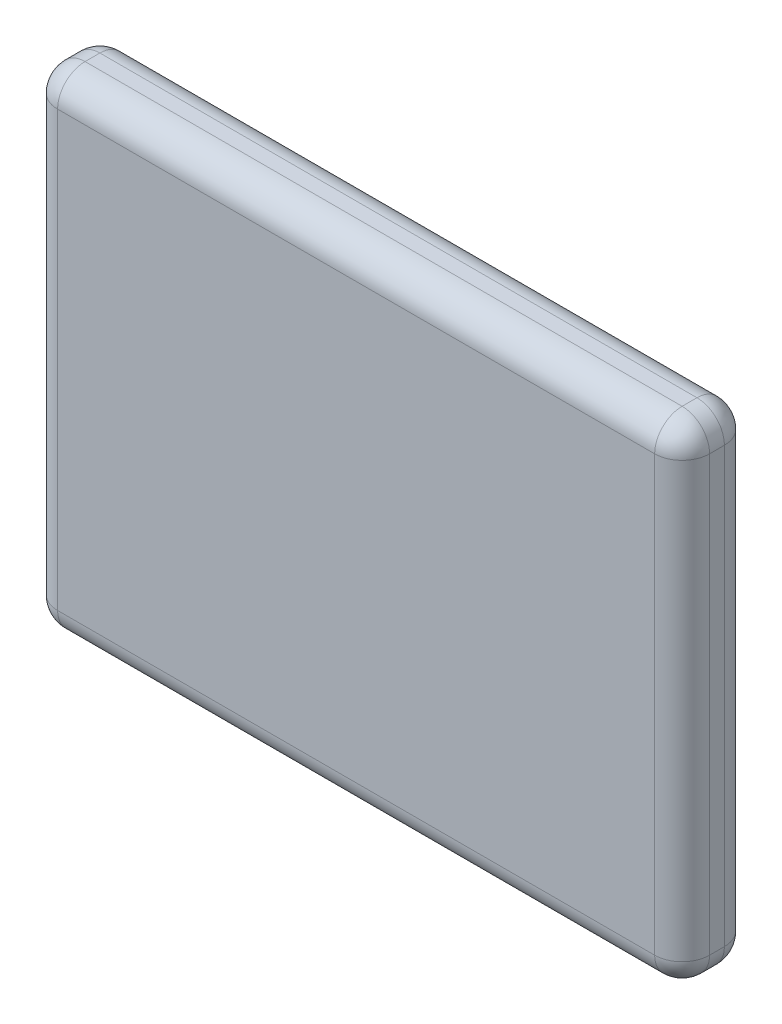
ISO-10303-21;
HEADER;
FILE_DESCRIPTION(('STEP AP214'),'2;1');
FILE_NAME('part.step','',(''),(''),'','','');
FILE_SCHEMA(('AUTOMOTIVE_DESIGN { 1 0 10303 214 1 1 1 1 }'));
ENDSEC;
DATA;
#1=APPLICATION_CONTEXT('core data for automotive mechanical design processes');
#2=APPLICATION_PROTOCOL_DEFINITION('international standard','automotive_design',2000,#1);
#3=PRODUCT_CONTEXT('',#1,'mechanical');
#4=PRODUCT('Part','Part','',(#3));
#5=PRODUCT_RELATED_PRODUCT_CATEGORY('part','',(#4));
#6=PRODUCT_DEFINITION_FORMATION('','',#4);
#7=PRODUCT_DEFINITION_CONTEXT('part definition',#1,'design');
#8=PRODUCT_DEFINITION('design','',#6,#7);
#9=PRODUCT_DEFINITION_SHAPE('','',#8);
#10=(LENGTH_UNIT() NAMED_UNIT(*) SI_UNIT(.MILLI.,.METRE.));
#11=(NAMED_UNIT(*) PLANE_ANGLE_UNIT() SI_UNIT($,.RADIAN.));
#12=(NAMED_UNIT(*) SI_UNIT($,.STERADIAN.) SOLID_ANGLE_UNIT());
#13=UNCERTAINTY_MEASURE_WITH_UNIT(LENGTH_MEASURE(1.E-05),#10,'distance_accuracy_value','');
#14=(GEOMETRIC_REPRESENTATION_CONTEXT(3) GLOBAL_UNCERTAINTY_ASSIGNED_CONTEXT((#13)) GLOBAL_UNIT_ASSIGNED_CONTEXT((#10,
#11,#12)) REPRESENTATION_CONTEXT('',''));
#15=CARTESIAN_POINT('',(0.,0.,0.));
#16=DIRECTION('',(0.,0.,1.));
#17=DIRECTION('',(1.,0.,0.));
#18=AXIS2_PLACEMENT_3D('',#15,#16,#17);
#19=CARTESIAN_POINT('',(-288.838268792711,70.5580865603644,50.8));
#20=DIRECTION('',(1.,0.,0.));
#21=DIRECTION('',(0.,1.,0.));
#22=AXIS2_PLACEMENT_3D('',#19,#20,#21);
#23=PLANE('',#22);
#24=DIRECTION('',(0.,0.,-1.));
#25=VECTOR('',#24,1.);
#26=CARTESIAN_POINT('',(-288.838268792711,50.5580865603644,50.8));
#27=LINE('',#26,#25);
#28=CARTESIAN_POINT('',(-288.838268792711,50.5580865603644,30.8));
#29=VERTEX_POINT('',#28);
#30=CARTESIAN_POINT('',(-288.838268792711,50.5580865603644,20.));
#31=VERTEX_POINT('',#30);
#32=EDGE_CURVE('E145',#29,#31,#27,.T.);
#33=ORIENTED_EDGE('',*,*,#32,.T.);
#34=DIRECTION('',(0.,-1.,0.));
#35=VECTOR('',#34,1.);
#36=CARTESIAN_POINT('',(-288.838268792711,70.5580865603644,20.));
#37=LINE('',#36,#35);
#38=CARTESIAN_POINT('',(-288.838268792711,-265.781913439636,20.));
#39=VERTEX_POINT('',#38);
#40=EDGE_CURVE('E210',#31,#39,#37,.T.);
#41=ORIENTED_EDGE('',*,*,#40,.T.);
#42=DIRECTION('',(0.,0.,-1.));
#43=VECTOR('',#42,1.);
#44=CARTESIAN_POINT('',(-288.838268792711,-265.781913439636,50.8));
#45=LINE('',#44,#43);
#46=CARTESIAN_POINT('',(-288.838268792711,-265.781913439636,30.8));
#47=VERTEX_POINT('',#46);
#48=EDGE_CURVE('E179',#39,#47,#45,.F.);
#49=ORIENTED_EDGE('',*,*,#48,.T.);
#50=DIRECTION('',(0.,-1.,0.));
#51=VECTOR('',#50,1.);
#52=CARTESIAN_POINT('',(-288.838268792711,70.5580865603644,30.8));
#53=LINE('',#52,#51);
#54=EDGE_CURVE('E292',#47,#29,#53,.F.);
#55=ORIENTED_EDGE('',*,*,#54,.T.);
#56=EDGE_LOOP('',(#33,#41,#49,#55));
#57=FACE_BOUND('',#56,.T.);
#58=ADVANCED_FACE('F43',(#57),#23,.F.);
#59=CARTESIAN_POINT('',(-288.838268792711,-285.781913439636,50.8));
#60=DIRECTION('',(0.,1.,0.));
#61=DIRECTION('',(0.,0.,1.));
#62=AXIS2_PLACEMENT_3D('',#59,#60,#61);
#63=PLANE('',#62);
#64=DIRECTION('',(0.,0.,-1.));
#65=VECTOR('',#64,1.);
#66=CARTESIAN_POINT('',(-268.838268792711,-285.781913439636,50.8));
#67=LINE('',#66,#65);
#68=CARTESIAN_POINT('',(-268.838268792711,-285.781913439636,30.8));
#69=VERTEX_POINT('',#68);
#70=CARTESIAN_POINT('',(-268.838268792711,-285.781913439636,20.));
#71=VERTEX_POINT('',#70);
#72=EDGE_CURVE('E249',#69,#71,#67,.T.);
#73=ORIENTED_EDGE('',*,*,#72,.T.);
#74=DIRECTION('',(1.,0.,0.));
#75=VECTOR('',#74,1.);
#76=CARTESIAN_POINT('',(-288.838268792711,-285.781913439636,20.));
#77=LINE('',#76,#75);
#78=CARTESIAN_POINT('',(166.161731207289,-285.781913439636,20.));
#79=VERTEX_POINT('',#78);
#80=EDGE_CURVE('E206',#71,#79,#77,.T.);
#81=ORIENTED_EDGE('',*,*,#80,.T.);
#82=DIRECTION('',(0.,0.,-1.));
#83=VECTOR('',#82,1.);
#84=CARTESIAN_POINT('',(166.161731207289,-285.781913439636,50.8));
#85=LINE('',#84,#83);
#86=CARTESIAN_POINT('',(166.161731207289,-285.781913439636,30.8));
#87=VERTEX_POINT('',#86);
#88=EDGE_CURVE('E256',#79,#87,#85,.F.);
#89=ORIENTED_EDGE('',*,*,#88,.T.);
#90=DIRECTION('',(1.,0.,0.));
#91=VECTOR('',#90,1.);
#92=CARTESIAN_POINT('',(-288.838268792711,-285.781913439636,30.8));
#93=LINE('',#92,#91);
#94=EDGE_CURVE('E255',#87,#69,#93,.F.);
#95=ORIENTED_EDGE('',*,*,#94,.T.);
#96=EDGE_LOOP('',(#73,#81,#89,#95));
#97=FACE_BOUND('',#96,.T.);
#98=ADVANCED_FACE('F252',(#97),#63,.F.);
#99=CARTESIAN_POINT('',(186.161731207289,70.5580865603644,50.8));
#100=DIRECTION('',(-1.,0.,0.));
#101=DIRECTION('',(0.,-1.,0.));
#102=AXIS2_PLACEMENT_3D('',#99,#100,#101);
#103=PLANE('',#102);
#104=DIRECTION('',(0.,0.,-1.));
#105=VECTOR('',#104,1.);
#106=CARTESIAN_POINT('',(186.161731207289,-265.781913439636,50.8));
#107=LINE('',#106,#105);
#108=CARTESIAN_POINT('',(186.161731207289,-265.781913439636,30.8));
#109=VERTEX_POINT('',#108);
#110=CARTESIAN_POINT('',(186.161731207289,-265.781913439636,20.));
#111=VERTEX_POINT('',#110);
#112=EDGE_CURVE('E261',#109,#111,#107,.T.);
#113=ORIENTED_EDGE('',*,*,#112,.T.);
#114=DIRECTION('',(0.,1.,0.));
#115=VECTOR('',#114,1.);
#116=CARTESIAN_POINT('',(186.161731207289,70.5580865603644,20.));
#117=LINE('',#116,#115);
#118=CARTESIAN_POINT('',(186.161731207289,50.5580865603644,20.));
#119=VERTEX_POINT('',#118);
#120=EDGE_CURVE('E193',#111,#119,#117,.T.);
#121=ORIENTED_EDGE('',*,*,#120,.T.);
#122=DIRECTION('',(0.,0.,-1.));
#123=VECTOR('',#122,1.);
#124=CARTESIAN_POINT('',(186.161731207289,50.5580865603644,50.8));
#125=LINE('',#124,#123);
#126=CARTESIAN_POINT('',(186.161731207289,50.5580865603644,30.8));
#127=VERTEX_POINT('',#126);
#128=EDGE_CURVE('E257',#119,#127,#125,.F.);
#129=ORIENTED_EDGE('',*,*,#128,.T.);
#130=DIRECTION('',(0.,1.,0.));
#131=VECTOR('',#130,1.);
#132=CARTESIAN_POINT('',(186.161731207289,-285.781913439636,30.8));
#133=LINE('',#132,#131);
#134=EDGE_CURVE('E140',#127,#109,#133,.F.);
#135=ORIENTED_EDGE('',*,*,#134,.T.);
#136=EDGE_LOOP('',(#113,#121,#129,#135));
#137=FACE_BOUND('',#136,.T.);
#138=ADVANCED_FACE('F323',(#137),#103,.F.);
#139=CARTESIAN_POINT('',(-288.838268792711,70.5580865603644,50.8));
#140=DIRECTION('',(0.,-1.,0.));
#141=DIRECTION('',(0.,0.,-1.));
#142=AXIS2_PLACEMENT_3D('',#139,#140,#141);
#143=PLANE('',#142);
#144=DIRECTION('',(0.,0.,-1.));
#145=VECTOR('',#144,1.);
#146=CARTESIAN_POINT('',(166.161731207289,70.5580865603644,50.8));
#147=LINE('',#146,#145);
#148=CARTESIAN_POINT('',(166.161731207289,70.5580865603644,30.8));
#149=VERTEX_POINT('',#148);
#150=CARTESIAN_POINT('',(166.161731207289,70.5580865603644,20.));
#151=VERTEX_POINT('',#150);
#152=EDGE_CURVE('E283',#149,#151,#147,.T.);
#153=ORIENTED_EDGE('',*,*,#152,.T.);
#154=DIRECTION('',(-1.,0.,0.));
#155=VECTOR('',#154,1.);
#156=CARTESIAN_POINT('',(-288.838268792711,70.5580865603644,20.));
#157=LINE('',#156,#155);
#158=CARTESIAN_POINT('',(-268.838268792711,70.5580865603644,20.));
#159=VERTEX_POINT('',#158);
#160=EDGE_CURVE('E11',#151,#159,#157,.T.);
#161=ORIENTED_EDGE('',*,*,#160,.T.);
#162=DIRECTION('',(0.,0.,-1.));
#163=VECTOR('',#162,1.);
#164=CARTESIAN_POINT('',(-268.838268792711,70.5580865603644,50.8));
#165=LINE('',#164,#163);
#166=CARTESIAN_POINT('',(-268.838268792711,70.5580865603644,30.8));
#167=VERTEX_POINT('',#166);
#168=EDGE_CURVE('E284',#159,#167,#165,.F.);
#169=ORIENTED_EDGE('',*,*,#168,.T.);
#170=DIRECTION('',(-1.,0.,0.));
#171=VECTOR('',#170,1.);
#172=CARTESIAN_POINT('',(186.161731207289,70.5580865603644,30.8));
#173=LINE('',#172,#171);
#174=EDGE_CURVE('E288',#167,#149,#173,.F.);
#175=ORIENTED_EDGE('',*,*,#174,.T.);
#176=EDGE_LOOP('',(#153,#161,#169,#175));
#177=FACE_BOUND('',#176,.T.);
#178=ADVANCED_FACE('F490',(#177),#143,.F.);
#179=CARTESIAN_POINT('',(0.,0.,50.8));
#180=DIRECTION('',(0.,0.,1.));
#181=DIRECTION('',(1.,0.,0.));
#182=AXIS2_PLACEMENT_3D('',#179,#180,#181);
#183=PLANE('',#182);
#184=DIRECTION('',(-1.,0.,0.));
#185=VECTOR('',#184,1.);
#186=CARTESIAN_POINT('',(-288.838268792711,50.5580865603644,50.8));
#187=LINE('',#186,#185);
#188=CARTESIAN_POINT('',(166.161731207289,50.5580865603644,50.8));
#189=VERTEX_POINT('',#188);
#190=CARTESIAN_POINT('',(-268.838268792711,50.5580865603644,50.8));
#191=VERTEX_POINT('',#190);
#192=EDGE_CURVE('E154',#189,#191,#187,.T.);
#193=ORIENTED_EDGE('',*,*,#192,.T.);
#194=DIRECTION('',(0.,-1.,0.));
#195=VECTOR('',#194,1.);
#196=CARTESIAN_POINT('',(-268.838268792711,-285.781913439636,50.8));
#197=LINE('',#196,#195);
#198=CARTESIAN_POINT('',(-268.838268792711,-265.781913439636,50.8));
#199=VERTEX_POINT('',#198);
#200=EDGE_CURVE('E295',#191,#199,#197,.T.);
#201=ORIENTED_EDGE('',*,*,#200,.T.);
#202=DIRECTION('',(1.,0.,0.));
#203=VECTOR('',#202,1.);
#204=CARTESIAN_POINT('',(186.161731207289,-265.781913439636,50.8));
#205=LINE('',#204,#203);
#206=CARTESIAN_POINT('',(166.161731207289,-265.781913439636,50.8));
#207=VERTEX_POINT('',#206);
#208=EDGE_CURVE('E157',#199,#207,#205,.T.);
#209=ORIENTED_EDGE('',*,*,#208,.T.);
#210=DIRECTION('',(0.,1.,0.));
#211=VECTOR('',#210,1.);
#212=CARTESIAN_POINT('',(166.161731207289,70.5580865603644,50.8));
#213=LINE('',#212,#211);
#214=EDGE_CURVE('E137',#207,#189,#213,.T.);
#215=ORIENTED_EDGE('',*,*,#214,.T.);
#216=EDGE_LOOP('',(#193,#201,#209,#215));
#217=FACE_BOUND('',#216,.T.);
#218=ADVANCED_FACE('F152',(#217),#183,.T.);
#219=CARTESIAN_POINT('',(0.,0.,0.));
#220=DIRECTION('',(0.,0.,1.));
#221=DIRECTION('',(1.,0.,0.));
#222=AXIS2_PLACEMENT_3D('',#219,#220,#221);
#223=PLANE('',#222);
#224=DIRECTION('',(-1.,0.,0.));
#225=VECTOR('',#224,1.);
#226=CARTESIAN_POINT('',(0.,50.5580865603644,0.));
#227=LINE('',#226,#225);
#228=CARTESIAN_POINT('',(-268.838268792711,50.5580865603644,0.));
#229=VERTEX_POINT('',#228);
#230=CARTESIAN_POINT('',(166.161731207289,50.5580865603644,0.));
#231=VERTEX_POINT('',#230);
#232=EDGE_CURVE('E195',#229,#231,#227,.F.);
#233=ORIENTED_EDGE('',*,*,#232,.T.);
#234=DIRECTION('',(0.,1.,0.));
#235=VECTOR('',#234,1.);
#236=CARTESIAN_POINT('',(166.161731207289,0.,0.));
#237=LINE('',#236,#235);
#238=CARTESIAN_POINT('',(166.161731207289,-265.781913439636,0.));
#239=VERTEX_POINT('',#238);
#240=EDGE_CURVE('E201',#231,#239,#237,.F.);
#241=ORIENTED_EDGE('',*,*,#240,.T.);
#242=DIRECTION('',(1.,0.,0.));
#243=VECTOR('',#242,1.);
#244=CARTESIAN_POINT('',(0.,-265.781913439636,0.));
#245=LINE('',#244,#243);
#246=CARTESIAN_POINT('',(-268.838268792711,-265.781913439636,0.));
#247=VERTEX_POINT('',#246);
#248=EDGE_CURVE('E199',#239,#247,#245,.F.);
#249=ORIENTED_EDGE('',*,*,#248,.T.);
#250=DIRECTION('',(0.,-1.,0.));
#251=VECTOR('',#250,1.);
#252=CARTESIAN_POINT('',(-268.838268792711,0.,0.));
#253=LINE('',#252,#251);
#254=EDGE_CURVE('E197',#247,#229,#253,.F.);
#255=ORIENTED_EDGE('',*,*,#254,.T.);
#256=EDGE_LOOP('',(#233,#241,#249,#255));
#257=FACE_BOUND('',#256,.T.);
#258=ADVANCED_FACE('F335',(#257),#223,.F.);
#259=CARTESIAN_POINT('',(166.161731207289,0.,30.8));
#260=DIRECTION('',(0.,-1.,0.));
#261=DIRECTION('',(1.,0.,0.));
#262=AXIS2_PLACEMENT_3D('',#259,#260,#261);
#263=CYLINDRICAL_SURFACE('',#262,20.);
#264=ORIENTED_EDGE('',*,*,#134,.F.);
#265=CARTESIAN_POINT('',(166.161731207289,50.5580865603644,30.8));
#266=DIRECTION('',(0.,-1.,0.));
#267=DIRECTION('',(1.,0.,0.));
#268=AXIS2_PLACEMENT_3D('',#265,#266,#267);
#269=CIRCLE('',#268,20.);
#270=EDGE_CURVE('E134',#127,#189,#269,.T.);
#271=ORIENTED_EDGE('',*,*,#270,.T.);
#272=ORIENTED_EDGE('',*,*,#214,.F.);
#273=CARTESIAN_POINT('',(166.161731207289,-265.781913439636,30.8));
#274=DIRECTION('',(0.,-1.,0.));
#275=DIRECTION('',(1.,0.,0.));
#276=AXIS2_PLACEMENT_3D('',#273,#274,#275);
#277=CIRCLE('',#276,20.);
#278=EDGE_CURVE('E146',#207,#109,#277,.F.);
#279=ORIENTED_EDGE('',*,*,#278,.T.);
#280=EDGE_LOOP('',(#264,#271,#272,#279));
#281=FACE_BOUND('',#280,.T.);
#282=ADVANCED_FACE('F136',(#281),#263,.T.);
#283=CARTESIAN_POINT('',(0.,50.5580865603644,30.8));
#284=DIRECTION('',(1.,0.,0.));
#285=DIRECTION('',(0.,0.,-1.));
#286=AXIS2_PLACEMENT_3D('',#283,#284,#285);
#287=CYLINDRICAL_SURFACE('',#286,20.);
#288=ORIENTED_EDGE('',*,*,#174,.F.);
#289=CARTESIAN_POINT('',(-268.838268792711,50.5580865603644,30.8));
#290=DIRECTION('',(1.,0.,0.));
#291=DIRECTION('',(0.,0.,-1.));
#292=AXIS2_PLACEMENT_3D('',#289,#290,#291);
#293=CIRCLE('',#292,20.);
#294=EDGE_CURVE('E165',#167,#191,#293,.T.);
#295=ORIENTED_EDGE('',*,*,#294,.T.);
#296=ORIENTED_EDGE('',*,*,#192,.F.);
#297=CARTESIAN_POINT('',(166.161731207289,50.5580865603644,30.8));
#298=DIRECTION('',(1.,0.,0.));
#299=DIRECTION('',(0.,0.,-1.));
#300=AXIS2_PLACEMENT_3D('',#297,#298,#299);
#301=CIRCLE('',#300,20.);
#302=EDGE_CURVE('E162',#189,#149,#301,.F.);
#303=ORIENTED_EDGE('',*,*,#302,.T.);
#304=EDGE_LOOP('',(#288,#295,#296,#303));
#305=FACE_BOUND('',#304,.T.);
#306=ADVANCED_FACE('F161',(#305),#287,.T.);
#307=CARTESIAN_POINT('',(0.,-265.781913439636,30.8));
#308=DIRECTION('',(-1.,0.,0.));
#309=DIRECTION('',(0.,0.,1.));
#310=AXIS2_PLACEMENT_3D('',#307,#308,#309);
#311=CYLINDRICAL_SURFACE('',#310,20.);
#312=ORIENTED_EDGE('',*,*,#208,.F.);
#313=CARTESIAN_POINT('',(-268.838268792711,-265.781913439636,30.8));
#314=DIRECTION('',(-1.,0.,0.));
#315=DIRECTION('',(0.,0.,1.));
#316=AXIS2_PLACEMENT_3D('',#313,#314,#315);
#317=CIRCLE('',#316,20.);
#318=EDGE_CURVE('E170',#199,#69,#317,.F.);
#319=ORIENTED_EDGE('',*,*,#318,.T.);
#320=ORIENTED_EDGE('',*,*,#94,.F.);
#321=CARTESIAN_POINT('',(166.161731207289,-265.781913439636,30.8));
#322=DIRECTION('',(-1.,0.,0.));
#323=DIRECTION('',(0.,0.,1.));
#324=AXIS2_PLACEMENT_3D('',#321,#322,#323);
#325=CIRCLE('',#324,20.);
#326=EDGE_CURVE('E173',#87,#207,#325,.T.);
#327=ORIENTED_EDGE('',*,*,#326,.T.);
#328=EDGE_LOOP('',(#312,#319,#320,#327));
#329=FACE_BOUND('',#328,.T.);
#330=ADVANCED_FACE('F271',(#329),#311,.T.);
#331=CARTESIAN_POINT('',(-268.838268792711,0.,30.8));
#332=DIRECTION('',(0.,1.,0.));
#333=DIRECTION('',(-1.,0.,0.));
#334=AXIS2_PLACEMENT_3D('',#331,#332,#333);
#335=CYLINDRICAL_SURFACE('',#334,20.);
#336=ORIENTED_EDGE('',*,*,#54,.F.);
#337=CARTESIAN_POINT('',(-268.838268792711,-265.781913439636,30.8));
#338=DIRECTION('',(0.,1.,0.));
#339=DIRECTION('',(-1.,0.,0.));
#340=AXIS2_PLACEMENT_3D('',#337,#338,#339);
#341=CIRCLE('',#340,20.);
#342=EDGE_CURVE('E267',#47,#199,#341,.T.);
#343=ORIENTED_EDGE('',*,*,#342,.T.);
#344=ORIENTED_EDGE('',*,*,#200,.F.);
#345=CARTESIAN_POINT('',(-268.838268792711,50.5580865603644,30.8));
#346=DIRECTION('',(0.,1.,0.));
#347=DIRECTION('',(-1.,0.,0.));
#348=AXIS2_PLACEMENT_3D('',#345,#346,#347);
#349=CIRCLE('',#348,20.);
#350=EDGE_CURVE('E259',#191,#29,#349,.F.);
#351=ORIENTED_EDGE('',*,*,#350,.T.);
#352=EDGE_LOOP('',(#336,#343,#344,#351));
#353=FACE_BOUND('',#352,.T.);
#354=ADVANCED_FACE('F300',(#353),#335,.T.);
#355=CARTESIAN_POINT('',(166.161731207289,50.5580865603644,30.8));
#356=DIRECTION('',(0.,0.,1.));
#357=DIRECTION('',(1.,0.,0.));
#358=AXIS2_PLACEMENT_3D('',#355,#356,#357);
#359=SPHERICAL_SURFACE('',#358,20.);
#360=ORIENTED_EDGE('',*,*,#302,.F.);
#361=ORIENTED_EDGE('',*,*,#270,.F.);
#362=CARTESIAN_POINT('',(166.161731207289,50.5580865603644,30.8));
#363=DIRECTION('',(0.,0.,-1.));
#364=DIRECTION('',(-1.,0.,0.));
#365=AXIS2_PLACEMENT_3D('',#362,#363,#364);
#366=CIRCLE('',#365,20.);
#367=EDGE_CURVE('E166',#149,#127,#366,.T.);
#368=ORIENTED_EDGE('',*,*,#367,.F.);
#369=EDGE_LOOP('',(#360,#361,#368));
#370=FACE_BOUND('',#369,.T.);
#371=ADVANCED_FACE('F168',(#370),#359,.T.);
#372=CARTESIAN_POINT('',(166.161731207289,50.5580865603644,50.8));
#373=DIRECTION('',(0.,0.,-1.));
#374=DIRECTION('',(-1.,0.,0.));
#375=AXIS2_PLACEMENT_3D('',#372,#373,#374);
#376=CYLINDRICAL_SURFACE('',#375,20.);
#377=ORIENTED_EDGE('',*,*,#128,.F.);
#378=CARTESIAN_POINT('',(166.161731207289,50.5580865603644,20.));
#379=DIRECTION('',(0.,0.,-1.));
#380=DIRECTION('',(-1.,0.,0.));
#381=AXIS2_PLACEMENT_3D('',#378,#379,#380);
#382=CIRCLE('',#381,20.);
#383=EDGE_CURVE('E181',#119,#151,#382,.F.);
#384=ORIENTED_EDGE('',*,*,#383,.T.);
#385=ORIENTED_EDGE('',*,*,#152,.F.);
#386=ORIENTED_EDGE('',*,*,#367,.T.);
#387=EDGE_LOOP('',(#377,#384,#385,#386));
#388=FACE_BOUND('',#387,.T.);
#389=ADVANCED_FACE('F336',(#388),#376,.T.);
#390=CARTESIAN_POINT('',(166.161731207289,-265.781913439636,30.8));
#391=DIRECTION('',(0.,0.,1.));
#392=DIRECTION('',(1.,0.,0.));
#393=AXIS2_PLACEMENT_3D('',#390,#391,#392);
#394=SPHERICAL_SURFACE('',#393,20.);
#395=ORIENTED_EDGE('',*,*,#278,.F.);
#396=ORIENTED_EDGE('',*,*,#326,.F.);
#397=CARTESIAN_POINT('',(166.161731207289,-265.781913439636,30.8));
#398=DIRECTION('',(0.,0.,-1.));
#399=DIRECTION('',(-1.,0.,0.));
#400=AXIS2_PLACEMENT_3D('',#397,#398,#399);
#401=CIRCLE('',#400,20.);
#402=EDGE_CURVE('E183',#109,#87,#401,.T.);
#403=ORIENTED_EDGE('',*,*,#402,.F.);
#404=EDGE_LOOP('',(#395,#396,#403));
#405=FACE_BOUND('',#404,.T.);
#406=ADVANCED_FACE('F274',(#405),#394,.T.);
#407=CARTESIAN_POINT('',(166.161731207289,-265.781913439636,50.8));
#408=DIRECTION('',(0.,0.,-1.));
#409=DIRECTION('',(-1.,0.,0.));
#410=AXIS2_PLACEMENT_3D('',#407,#408,#409);
#411=CYLINDRICAL_SURFACE('',#410,20.);
#412=ORIENTED_EDGE('',*,*,#88,.F.);
#413=CARTESIAN_POINT('',(166.161731207289,-265.781913439636,20.));
#414=DIRECTION('',(0.,0.,-1.));
#415=DIRECTION('',(-1.,0.,0.));
#416=AXIS2_PLACEMENT_3D('',#413,#414,#415);
#417=CIRCLE('',#416,20.);
#418=EDGE_CURVE('E204',#79,#111,#417,.F.);
#419=ORIENTED_EDGE('',*,*,#418,.T.);
#420=ORIENTED_EDGE('',*,*,#112,.F.);
#421=ORIENTED_EDGE('',*,*,#402,.T.);
#422=EDGE_LOOP('',(#412,#419,#420,#421));
#423=FACE_BOUND('',#422,.T.);
#424=ADVANCED_FACE('F277',(#423),#411,.T.);
#425=CARTESIAN_POINT('',(-268.838268792711,-265.781913439636,50.8));
#426=DIRECTION('',(0.,0.,-1.));
#427=DIRECTION('',(-1.,0.,0.));
#428=AXIS2_PLACEMENT_3D('',#425,#426,#427);
#429=CYLINDRICAL_SURFACE('',#428,20.);
#430=ORIENTED_EDGE('',*,*,#48,.F.);
#431=CARTESIAN_POINT('',(-268.838268792711,-265.781913439636,20.));
#432=DIRECTION('',(0.,0.,-1.));
#433=DIRECTION('',(-1.,0.,0.));
#434=AXIS2_PLACEMENT_3D('',#431,#432,#433);
#435=CIRCLE('',#434,20.);
#436=EDGE_CURVE('E208',#39,#71,#435,.F.);
#437=ORIENTED_EDGE('',*,*,#436,.T.);
#438=ORIENTED_EDGE('',*,*,#72,.F.);
#439=CARTESIAN_POINT('',(-268.838268792711,-265.781913439636,30.8));
#440=DIRECTION('',(0.,0.,1.));
#441=DIRECTION('',(1.,0.,0.));
#442=AXIS2_PLACEMENT_3D('',#439,#440,#441);
#443=CIRCLE('',#442,20.);
#444=EDGE_CURVE('E186',#47,#69,#443,.T.);
#445=ORIENTED_EDGE('',*,*,#444,.F.);
#446=EDGE_LOOP('',(#430,#437,#438,#445));
#447=FACE_BOUND('',#446,.T.);
#448=ADVANCED_FACE('F247',(#447),#429,.T.);
#449=CARTESIAN_POINT('',(-268.838268792711,-265.781913439636,30.8));
#450=DIRECTION('',(0.,0.,1.));
#451=DIRECTION('',(1.,0.,0.));
#452=AXIS2_PLACEMENT_3D('',#449,#450,#451);
#453=SPHERICAL_SURFACE('',#452,20.);
#454=ORIENTED_EDGE('',*,*,#444,.T.);
#455=ORIENTED_EDGE('',*,*,#318,.F.);
#456=ORIENTED_EDGE('',*,*,#342,.F.);
#457=EDGE_LOOP('',(#454,#455,#456));
#458=FACE_BOUND('',#457,.T.);
#459=ADVANCED_FACE('F308',(#458),#453,.T.);
#460=CARTESIAN_POINT('',(-268.838268792711,50.5580865603644,50.8));
#461=DIRECTION('',(0.,0.,-1.));
#462=DIRECTION('',(-1.,0.,0.));
#463=AXIS2_PLACEMENT_3D('',#460,#461,#462);
#464=CYLINDRICAL_SURFACE('',#463,20.);
#465=ORIENTED_EDGE('',*,*,#168,.F.);
#466=CARTESIAN_POINT('',(-268.838268792711,50.5580865603644,20.));
#467=DIRECTION('',(0.,0.,-1.));
#468=DIRECTION('',(-1.,0.,0.));
#469=AXIS2_PLACEMENT_3D('',#466,#467,#468);
#470=CIRCLE('',#469,20.);
#471=EDGE_CURVE('E52',#159,#31,#470,.F.);
#472=ORIENTED_EDGE('',*,*,#471,.T.);
#473=ORIENTED_EDGE('',*,*,#32,.F.);
#474=CARTESIAN_POINT('',(-268.838268792711,50.5580865603644,30.8));
#475=DIRECTION('',(0.,0.,1.));
#476=DIRECTION('',(1.,0.,0.));
#477=AXIS2_PLACEMENT_3D('',#474,#475,#476);
#478=CIRCLE('',#477,20.);
#479=EDGE_CURVE('E189',#167,#29,#478,.T.);
#480=ORIENTED_EDGE('',*,*,#479,.F.);
#481=EDGE_LOOP('',(#465,#472,#473,#480));
#482=FACE_BOUND('',#481,.T.);
#483=ADVANCED_FACE('F305',(#482),#464,.T.);
#484=CARTESIAN_POINT('',(-268.838268792711,50.5580865603644,30.8));
#485=DIRECTION('',(0.,0.,1.));
#486=DIRECTION('',(1.,0.,0.));
#487=AXIS2_PLACEMENT_3D('',#484,#485,#486);
#488=SPHERICAL_SURFACE('',#487,20.);
#489=ORIENTED_EDGE('',*,*,#350,.F.);
#490=ORIENTED_EDGE('',*,*,#294,.F.);
#491=ORIENTED_EDGE('',*,*,#479,.T.);
#492=EDGE_LOOP('',(#489,#490,#491));
#493=FACE_BOUND('',#492,.T.);
#494=ADVANCED_FACE('F303',(#493),#488,.T.);
#495=CARTESIAN_POINT('',(-268.838268792711,-265.781913439636,20.));
#496=DIRECTION('',(0.,0.,1.));
#497=DIRECTION('',(1.,0.,0.));
#498=AXIS2_PLACEMENT_3D('',#495,#496,#497);
#499=SPHERICAL_SURFACE('',#498,20.);
#500=CARTESIAN_POINT('',(-268.838268792711,-265.781913439636,20.));
#501=DIRECTION('',(1.,0.,0.));
#502=DIRECTION('',(0.,0.,-1.));
#503=AXIS2_PLACEMENT_3D('',#500,#501,#502);
#504=CIRCLE('',#503,20.);
#505=EDGE_CURVE('E228',#71,#247,#504,.T.);
#506=ORIENTED_EDGE('',*,*,#505,.F.);
#507=ORIENTED_EDGE('',*,*,#436,.F.);
#508=CARTESIAN_POINT('',(-268.838268792711,-265.781913439636,20.));
#509=DIRECTION('',(0.,1.,0.));
#510=DIRECTION('',(0.,0.,1.));
#511=AXIS2_PLACEMENT_3D('',#508,#509,#510);
#512=CIRCLE('',#511,20.);
#513=EDGE_CURVE('E47',#247,#39,#512,.T.);
#514=ORIENTED_EDGE('',*,*,#513,.F.);
#515=EDGE_LOOP('',(#506,#507,#514));
#516=FACE_BOUND('',#515,.T.);
#517=ADVANCED_FACE('F45',(#516),#499,.T.);
#518=CARTESIAN_POINT('',(-268.838268792711,70.5580865603644,20.));
#519=DIRECTION('',(0.,-1.,0.));
#520=DIRECTION('',(1.,0.,0.));
#521=AXIS2_PLACEMENT_3D('',#518,#519,#520);
#522=CYLINDRICAL_SURFACE('',#521,20.);
#523=ORIENTED_EDGE('',*,*,#513,.T.);
#524=ORIENTED_EDGE('',*,*,#40,.F.);
#525=CARTESIAN_POINT('',(-268.838268792711,50.5580865603644,20.));
#526=DIRECTION('',(0.,1.,0.));
#527=DIRECTION('',(0.,0.,1.));
#528=AXIS2_PLACEMENT_3D('',#525,#526,#527);
#529=CIRCLE('',#528,20.);
#530=EDGE_CURVE('E226',#229,#31,#529,.T.);
#531=ORIENTED_EDGE('',*,*,#530,.F.);
#532=ORIENTED_EDGE('',*,*,#254,.F.);
#533=EDGE_LOOP('',(#523,#524,#531,#532));
#534=FACE_BOUND('',#533,.T.);
#535=ADVANCED_FACE('F239',(#534),#522,.T.);
#536=CARTESIAN_POINT('',(-288.838268792711,-265.781913439636,20.));
#537=DIRECTION('',(1.,0.,0.));
#538=DIRECTION('',(0.,0.,-1.));
#539=AXIS2_PLACEMENT_3D('',#536,#537,#538);
#540=CYLINDRICAL_SURFACE('',#539,20.);
#541=ORIENTED_EDGE('',*,*,#505,.T.);
#542=ORIENTED_EDGE('',*,*,#248,.F.);
#543=CARTESIAN_POINT('',(166.161731207289,-265.781913439636,20.));
#544=DIRECTION('',(1.,0.,0.));
#545=DIRECTION('',(0.,0.,-1.));
#546=AXIS2_PLACEMENT_3D('',#543,#544,#545);
#547=CIRCLE('',#546,20.);
#548=EDGE_CURVE('E223',#79,#239,#547,.T.);
#549=ORIENTED_EDGE('',*,*,#548,.F.);
#550=ORIENTED_EDGE('',*,*,#80,.F.);
#551=EDGE_LOOP('',(#541,#542,#549,#550));
#552=FACE_BOUND('',#551,.T.);
#553=ADVANCED_FACE('F383',(#552),#540,.T.);
#554=CARTESIAN_POINT('',(-268.838268792711,50.5580865603644,20.));
#555=DIRECTION('',(0.,0.,1.));
#556=DIRECTION('',(1.,0.,0.));
#557=AXIS2_PLACEMENT_3D('',#554,#555,#556);
#558=SPHERICAL_SURFACE('',#557,20.);
#559=ORIENTED_EDGE('',*,*,#530,.T.);
#560=ORIENTED_EDGE('',*,*,#471,.F.);
#561=CARTESIAN_POINT('',(-268.838268792711,50.5580865603644,20.));
#562=DIRECTION('',(1.,0.,0.));
#563=DIRECTION('',(0.,0.,-1.));
#564=AXIS2_PLACEMENT_3D('',#561,#562,#563);
#565=CIRCLE('',#564,20.);
#566=EDGE_CURVE('E220',#229,#159,#565,.T.);
#567=ORIENTED_EDGE('',*,*,#566,.F.);
#568=EDGE_LOOP('',(#559,#560,#567));
#569=FACE_BOUND('',#568,.T.);
#570=ADVANCED_FACE('F391',(#569),#558,.T.);
#571=CARTESIAN_POINT('',(166.161731207289,-265.781913439636,20.));
#572=DIRECTION('',(0.,0.,1.));
#573=DIRECTION('',(1.,0.,0.));
#574=AXIS2_PLACEMENT_3D('',#571,#572,#573);
#575=SPHERICAL_SURFACE('',#574,20.);
#576=ORIENTED_EDGE('',*,*,#418,.F.);
#577=ORIENTED_EDGE('',*,*,#548,.T.);
#578=CARTESIAN_POINT('',(166.161731207289,-265.781913439636,20.));
#579=DIRECTION('',(0.,1.,0.));
#580=DIRECTION('',(0.,0.,1.));
#581=AXIS2_PLACEMENT_3D('',#578,#579,#580);
#582=CIRCLE('',#581,20.);
#583=EDGE_CURVE('E218',#111,#239,#582,.T.);
#584=ORIENTED_EDGE('',*,*,#583,.F.);
#585=EDGE_LOOP('',(#576,#577,#584));
#586=FACE_BOUND('',#585,.T.);
#587=ADVANCED_FACE('F400',(#586),#575,.T.);
#588=CARTESIAN_POINT('',(-288.838268792711,50.5580865603644,20.));
#589=DIRECTION('',(-1.,0.,0.));
#590=DIRECTION('',(0.,0.,1.));
#591=AXIS2_PLACEMENT_3D('',#588,#589,#590);
#592=CYLINDRICAL_SURFACE('',#591,20.);
#593=ORIENTED_EDGE('',*,*,#566,.T.);
#594=ORIENTED_EDGE('',*,*,#160,.F.);
#595=CARTESIAN_POINT('',(166.161731207289,50.5580865603644,20.));
#596=DIRECTION('',(1.,0.,0.));
#597=DIRECTION('',(0.,0.,-1.));
#598=AXIS2_PLACEMENT_3D('',#595,#596,#597);
#599=CIRCLE('',#598,20.);
#600=EDGE_CURVE('E216',#231,#151,#599,.T.);
#601=ORIENTED_EDGE('',*,*,#600,.F.);
#602=ORIENTED_EDGE('',*,*,#232,.F.);
#603=EDGE_LOOP('',(#593,#594,#601,#602));
#604=FACE_BOUND('',#603,.T.);
#605=ADVANCED_FACE('F411',(#604),#592,.T.);
#606=CARTESIAN_POINT('',(166.161731207289,70.5580865603644,20.));
#607=DIRECTION('',(0.,1.,0.));
#608=DIRECTION('',(-1.,0.,0.));
#609=AXIS2_PLACEMENT_3D('',#606,#607,#608);
#610=CYLINDRICAL_SURFACE('',#609,20.);
#611=ORIENTED_EDGE('',*,*,#583,.T.);
#612=ORIENTED_EDGE('',*,*,#240,.F.);
#613=CARTESIAN_POINT('',(166.161731207289,50.5580865603644,20.));
#614=DIRECTION('',(0.,1.,0.));
#615=DIRECTION('',(0.,0.,1.));
#616=AXIS2_PLACEMENT_3D('',#613,#614,#615);
#617=CIRCLE('',#616,20.);
#618=EDGE_CURVE('E213',#119,#231,#617,.T.);
#619=ORIENTED_EDGE('',*,*,#618,.F.);
#620=ORIENTED_EDGE('',*,*,#120,.F.);
#621=EDGE_LOOP('',(#611,#612,#619,#620));
#622=FACE_BOUND('',#621,.T.);
#623=ADVANCED_FACE('F422',(#622),#610,.T.);
#624=CARTESIAN_POINT('',(166.161731207289,50.5580865603644,20.));
#625=DIRECTION('',(0.,0.,1.));
#626=DIRECTION('',(1.,0.,0.));
#627=AXIS2_PLACEMENT_3D('',#624,#625,#626);
#628=SPHERICAL_SURFACE('',#627,20.);
#629=ORIENTED_EDGE('',*,*,#600,.T.);
#630=ORIENTED_EDGE('',*,*,#383,.F.);
#631=ORIENTED_EDGE('',*,*,#618,.T.);
#632=EDGE_LOOP('',(#629,#630,#631));
#633=FACE_BOUND('',#632,.T.);
#634=ADVANCED_FACE('F432',(#633),#628,.T.);
#635=CLOSED_SHELL('',(#58,#98,#138,#178,#218,#258,#282,#306,#330,#354,#371,#389,#406,#424,#448,
#459,#483,#494,#517,#535,#553,#570,#587,#605,#623,#634));
#636=MANIFOLD_SOLID_BREP('B2',#635);
#637=ADVANCED_BREP_SHAPE_REPRESENTATION('',(#18,#636),#14);
#638=SHAPE_DEFINITION_REPRESENTATION(#9,#637);
ENDSEC;
END-ISO-10303-21;
